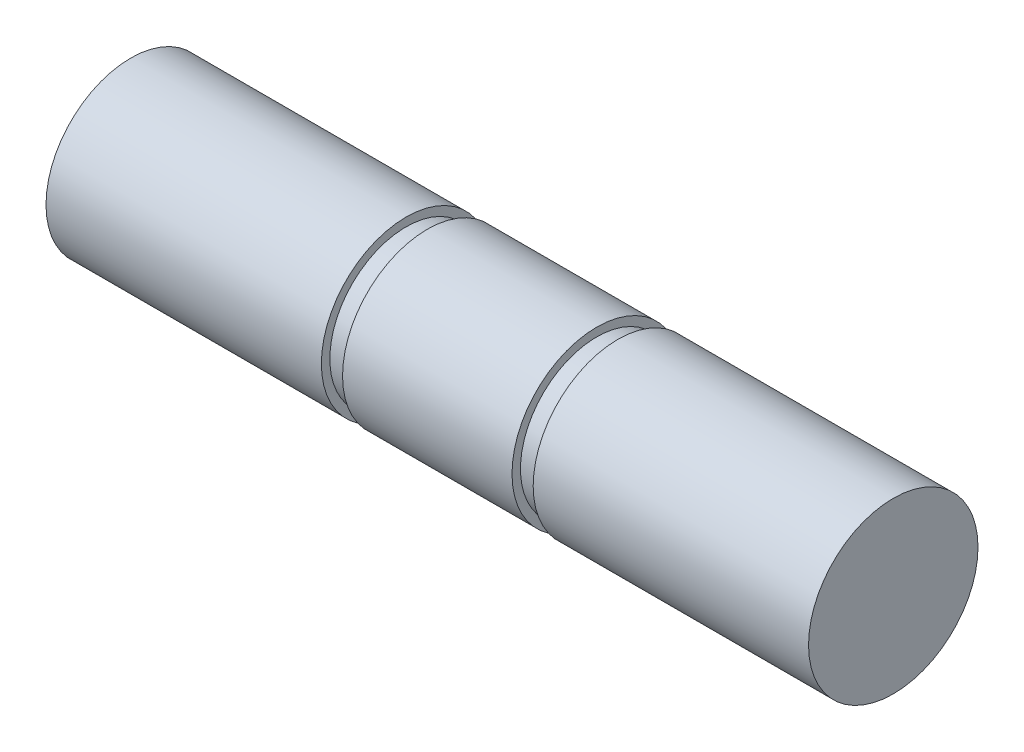
ISO-10303-21;
HEADER;
FILE_DESCRIPTION(('STEP AP214'),'2;1');
FILE_NAME('part.step','',(''),(''),'','','');
FILE_SCHEMA(('AUTOMOTIVE_DESIGN { 1 0 10303 214 1 1 1 1 }'));
ENDSEC;
DATA;
#1=APPLICATION_CONTEXT('core data for automotive mechanical design processes');
#2=APPLICATION_PROTOCOL_DEFINITION('international standard','automotive_design',2000,#1);
#3=PRODUCT_CONTEXT('',#1,'mechanical');
#4=PRODUCT('Part','Part','',(#3));
#5=PRODUCT_RELATED_PRODUCT_CATEGORY('part','',(#4));
#6=PRODUCT_DEFINITION_FORMATION('','',#4);
#7=PRODUCT_DEFINITION_CONTEXT('part definition',#1,'design');
#8=PRODUCT_DEFINITION('design','',#6,#7);
#9=PRODUCT_DEFINITION_SHAPE('','',#8);
#10=(LENGTH_UNIT() NAMED_UNIT(*) SI_UNIT(.MILLI.,.METRE.));
#11=(NAMED_UNIT(*) PLANE_ANGLE_UNIT() SI_UNIT($,.RADIAN.));
#12=(NAMED_UNIT(*) SI_UNIT($,.STERADIAN.) SOLID_ANGLE_UNIT());
#13=UNCERTAINTY_MEASURE_WITH_UNIT(LENGTH_MEASURE(1.E-05),#10,'distance_accuracy_value','');
#14=(GEOMETRIC_REPRESENTATION_CONTEXT(3) GLOBAL_UNCERTAINTY_ASSIGNED_CONTEXT((#13)) GLOBAL_UNIT_ASSIGNED_CONTEXT((#10,
#11,#12)) REPRESENTATION_CONTEXT('',''));
#15=CARTESIAN_POINT('',(0.,0.,0.));
#16=DIRECTION('',(0.,0.,1.));
#17=DIRECTION('',(1.,0.,0.));
#18=AXIS2_PLACEMENT_3D('',#15,#16,#17);
#19=CARTESIAN_POINT('',(18.,0.,0.));
#20=DIRECTION('',(-1.,0.,0.));
#21=DIRECTION('',(0.,0.,1.));
#22=AXIS2_PLACEMENT_3D('',#19,#20,#21);
#23=CYLINDRICAL_SURFACE('',#22,2.);
#24=CARTESIAN_POINT('',(11.,0.,0.));
#25=DIRECTION('',(1.,0.,0.));
#26=DIRECTION('',(0.,0.,-1.));
#27=AXIS2_PLACEMENT_3D('',#24,#25,#26);
#28=CIRCLE('',#27,2.);
#29=CARTESIAN_POINT('',(11.,0.,-2.));
#30=VERTEX_POINT('',#29);
#31=EDGE_CURVE('E55',#30,#30,#28,.T.);
#32=ORIENTED_EDGE('',*,*,#31,.F.);
#33=EDGE_LOOP('',(#32));
#34=FACE_BOUND('',#33,.T.);
#35=CARTESIAN_POINT('',(7.,0.,0.));
#36=DIRECTION('',(1.,0.,0.));
#37=DIRECTION('',(0.,0.,-1.));
#38=AXIS2_PLACEMENT_3D('',#35,#36,#37);
#39=CIRCLE('',#38,2.);
#40=CARTESIAN_POINT('',(7.,0.,-2.));
#41=VERTEX_POINT('',#40);
#42=EDGE_CURVE('E69',#41,#41,#39,.T.);
#43=ORIENTED_EDGE('',*,*,#42,.T.);
#44=EDGE_LOOP('',(#43));
#45=FACE_BOUND('',#44,.T.);
#46=ADVANCED_FACE('F42',(#34,#45),#23,.T.);
#47=CARTESIAN_POINT('',(11.,0.,0.));
#48=DIRECTION('',(1.,0.,0.));
#49=DIRECTION('',(0.,0.,-1.));
#50=AXIS2_PLACEMENT_3D('',#47,#48,#49);
#51=PLANE('',#50);
#52=CARTESIAN_POINT('',(11.,0.,0.));
#53=DIRECTION('',(1.,0.,0.));
#54=DIRECTION('',(0.,0.,-1.));
#55=AXIS2_PLACEMENT_3D('',#52,#53,#54);
#56=CIRCLE('',#55,1.8);
#57=CARTESIAN_POINT('',(11.,0.,-1.8));
#58=VERTEX_POINT('',#57);
#59=EDGE_CURVE('E61',#58,#58,#56,.T.);
#60=ORIENTED_EDGE('',*,*,#59,.F.);
#61=EDGE_LOOP('',(#60));
#62=FACE_BOUND('',#61,.T.);
#63=ORIENTED_EDGE('',*,*,#31,.T.);
#64=EDGE_LOOP('',(#63));
#65=FACE_BOUND('',#64,.T.);
#66=ADVANCED_FACE('F109',(#62,#65),#51,.T.);
#67=CARTESIAN_POINT('',(11.5,0.,0.));
#68=DIRECTION('',(1.,0.,0.));
#69=DIRECTION('',(0.,0.,-1.));
#70=AXIS2_PLACEMENT_3D('',#67,#68,#69);
#71=PLANE('',#70);
#72=CARTESIAN_POINT('',(11.5,0.,0.));
#73=DIRECTION('',(1.,0.,0.));
#74=DIRECTION('',(0.,0.,-1.));
#75=AXIS2_PLACEMENT_3D('',#72,#73,#74);
#76=CIRCLE('',#75,1.8);
#77=CARTESIAN_POINT('',(11.5,0.,-1.8));
#78=VERTEX_POINT('',#77);
#79=EDGE_CURVE('E65',#78,#78,#76,.T.);
#80=ORIENTED_EDGE('',*,*,#79,.T.);
#81=EDGE_LOOP('',(#80));
#82=FACE_BOUND('',#81,.T.);
#83=CARTESIAN_POINT('',(11.5,0.,0.));
#84=DIRECTION('',(1.,0.,0.));
#85=DIRECTION('',(0.,0.,-1.));
#86=AXIS2_PLACEMENT_3D('',#83,#84,#85);
#87=CIRCLE('',#86,2.);
#88=CARTESIAN_POINT('',(11.5,0.,-2.));
#89=VERTEX_POINT('',#88);
#90=EDGE_CURVE('E57',#89,#89,#87,.T.);
#91=ORIENTED_EDGE('',*,*,#90,.F.);
#92=EDGE_LOOP('',(#91));
#93=FACE_BOUND('',#92,.T.);
#94=ADVANCED_FACE('F116',(#82,#93),#71,.F.);
#95=CARTESIAN_POINT('',(11.,0.,0.));
#96=DIRECTION('',(1.,0.,0.));
#97=DIRECTION('',(0.,0.,-1.));
#98=AXIS2_PLACEMENT_3D('',#95,#96,#97);
#99=CYLINDRICAL_SURFACE('',#98,1.8);
#100=ORIENTED_EDGE('',*,*,#59,.T.);
#101=EDGE_LOOP('',(#100));
#102=FACE_BOUND('',#101,.T.);
#103=ORIENTED_EDGE('',*,*,#79,.F.);
#104=EDGE_LOOP('',(#103));
#105=FACE_BOUND('',#104,.T.);
#106=ADVANCED_FACE('F129',(#102,#105),#99,.T.);
#107=CARTESIAN_POINT('',(18.,0.,0.));
#108=DIRECTION('',(1.,0.,0.));
#109=DIRECTION('',(0.,0.,-1.));
#110=AXIS2_PLACEMENT_3D('',#107,#108,#109);
#111=PLANE('',#110);
#112=CARTESIAN_POINT('',(18.,0.,0.));
#113=DIRECTION('',(1.,0.,0.));
#114=DIRECTION('',(0.,0.,-1.));
#115=AXIS2_PLACEMENT_3D('',#112,#113,#114);
#116=CIRCLE('',#115,2.);
#117=CARTESIAN_POINT('',(18.,0.,-2.));
#118=VERTEX_POINT('',#117);
#119=EDGE_CURVE('E10',#118,#118,#116,.T.);
#120=ORIENTED_EDGE('',*,*,#119,.T.);
#121=EDGE_LOOP('',(#120));
#122=FACE_BOUND('',#121,.T.);
#123=ADVANCED_FACE('F123',(#122),#111,.T.);
#124=ORIENTED_EDGE('',*,*,#90,.T.);
#125=EDGE_LOOP('',(#124));
#126=FACE_BOUND('',#125,.T.);
#127=ORIENTED_EDGE('',*,*,#119,.F.);
#128=EDGE_LOOP('',(#127));
#129=FACE_BOUND('',#128,.T.);
#130=ADVANCED_FACE('F44',(#126,#129),#23,.T.);
#131=CARTESIAN_POINT('',(7.,0.,0.));
#132=DIRECTION('',(-1.,0.,0.));
#133=DIRECTION('',(0.,0.,-1.));
#134=AXIS2_PLACEMENT_3D('',#131,#132,#133);
#135=PLANE('',#134);
#136=ORIENTED_EDGE('',*,*,#42,.F.);
#137=EDGE_LOOP('',(#136));
#138=FACE_BOUND('',#137,.T.);
#139=CARTESIAN_POINT('',(7.,0.,0.));
#140=DIRECTION('',(1.,0.,0.));
#141=DIRECTION('',(0.,0.,-1.));
#142=AXIS2_PLACEMENT_3D('',#139,#140,#141);
#143=CIRCLE('',#142,1.8);
#144=CARTESIAN_POINT('',(7.,0.,-1.8));
#145=VERTEX_POINT('',#144);
#146=EDGE_CURVE('E77',#145,#145,#143,.T.);
#147=ORIENTED_EDGE('',*,*,#146,.T.);
#148=EDGE_LOOP('',(#147));
#149=FACE_BOUND('',#148,.T.);
#150=ADVANCED_FACE('F89',(#138,#149),#135,.T.);
#151=CARTESIAN_POINT('',(6.5,0.,0.));
#152=DIRECTION('',(-1.,0.,0.));
#153=DIRECTION('',(0.,0.,-1.));
#154=AXIS2_PLACEMENT_3D('',#151,#152,#153);
#155=PLANE('',#154);
#156=CARTESIAN_POINT('',(6.5,0.,0.));
#157=DIRECTION('',(1.,0.,0.));
#158=DIRECTION('',(0.,0.,-1.));
#159=AXIS2_PLACEMENT_3D('',#156,#157,#158);
#160=CIRCLE('',#159,2.);
#161=CARTESIAN_POINT('',(6.5,0.,-2.));
#162=VERTEX_POINT('',#161);
#163=EDGE_CURVE('E73',#162,#162,#160,.T.);
#164=ORIENTED_EDGE('',*,*,#163,.T.);
#165=EDGE_LOOP('',(#164));
#166=FACE_BOUND('',#165,.T.);
#167=CARTESIAN_POINT('',(6.5,0.,0.));
#168=DIRECTION('',(1.,0.,0.));
#169=DIRECTION('',(0.,0.,-1.));
#170=AXIS2_PLACEMENT_3D('',#167,#168,#169);
#171=CIRCLE('',#170,1.8);
#172=CARTESIAN_POINT('',(6.5,0.,-1.8));
#173=VERTEX_POINT('',#172);
#174=EDGE_CURVE('E81',#173,#173,#171,.T.);
#175=ORIENTED_EDGE('',*,*,#174,.F.);
#176=EDGE_LOOP('',(#175));
#177=FACE_BOUND('',#176,.T.);
#178=ADVANCED_FACE('F95',(#166,#177),#155,.F.);
#179=CARTESIAN_POINT('',(7.,0.,0.));
#180=DIRECTION('',(-1.,0.,0.));
#181=DIRECTION('',(0.,0.,1.));
#182=AXIS2_PLACEMENT_3D('',#179,#180,#181);
#183=CYLINDRICAL_SURFACE('',#182,1.8);
#184=ORIENTED_EDGE('',*,*,#146,.F.);
#185=EDGE_LOOP('',(#184));
#186=FACE_BOUND('',#185,.T.);
#187=ORIENTED_EDGE('',*,*,#174,.T.);
#188=EDGE_LOOP('',(#187));
#189=FACE_BOUND('',#188,.T.);
#190=ADVANCED_FACE('F91',(#186,#189),#183,.T.);
#191=CARTESIAN_POINT('',(0.,0.,0.));
#192=DIRECTION('',(1.,0.,0.));
#193=DIRECTION('',(0.,0.,-1.));
#194=AXIS2_PLACEMENT_3D('',#191,#192,#193);
#195=PLANE('',#194);
#196=CARTESIAN_POINT('',(0.,0.,0.));
#197=DIRECTION('',(1.,0.,0.));
#198=DIRECTION('',(0.,0.,-1.));
#199=AXIS2_PLACEMENT_3D('',#196,#197,#198);
#200=CIRCLE('',#199,2.);
#201=CARTESIAN_POINT('',(0.,0.,-2.));
#202=VERTEX_POINT('',#201);
#203=EDGE_CURVE('E46',#202,#202,#200,.T.);
#204=ORIENTED_EDGE('',*,*,#203,.F.);
#205=EDGE_LOOP('',(#204));
#206=FACE_BOUND('',#205,.T.);
#207=ADVANCED_FACE('F94',(#206),#195,.F.);
#208=ORIENTED_EDGE('',*,*,#163,.F.);
#209=EDGE_LOOP('',(#208));
#210=FACE_BOUND('',#209,.T.);
#211=ORIENTED_EDGE('',*,*,#203,.T.);
#212=EDGE_LOOP('',(#211));
#213=FACE_BOUND('',#212,.T.);
#214=ADVANCED_FACE('F111',(#210,#213),#23,.T.);
#215=CLOSED_SHELL('',(#46,#66,#94,#106,#123,#130,#150,#178,#190,#207,#214));
#216=MANIFOLD_SOLID_BREP('B2',#215);
#217=ADVANCED_BREP_SHAPE_REPRESENTATION('',(#18,#216),#14);
#218=SHAPE_DEFINITION_REPRESENTATION(#9,#217);
ENDSEC;
END-ISO-10303-21;
